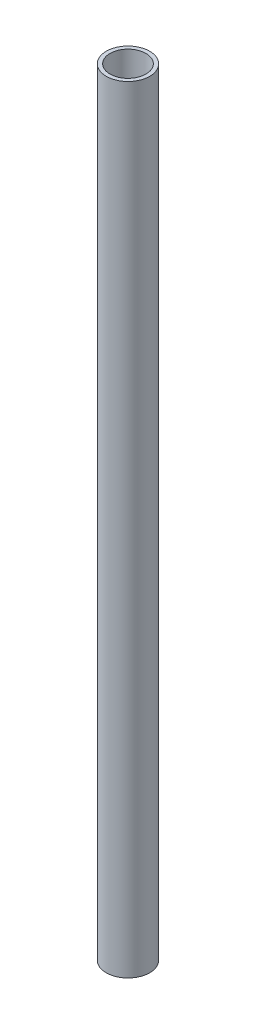
ISO-10303-21;
HEADER;
FILE_DESCRIPTION(('STEP AP214'),'2;1');
FILE_NAME('part.step','',(''),(''),'','','');
FILE_SCHEMA(('AUTOMOTIVE_DESIGN { 1 0 10303 214 1 1 1 1 }'));
ENDSEC;
DATA;
#1=APPLICATION_CONTEXT('core data for automotive mechanical design processes');
#2=APPLICATION_PROTOCOL_DEFINITION('international standard','automotive_design',2000,#1);
#3=PRODUCT_CONTEXT('',#1,'mechanical');
#4=PRODUCT('Part','Part','',(#3));
#5=PRODUCT_RELATED_PRODUCT_CATEGORY('part','',(#4));
#6=PRODUCT_DEFINITION_FORMATION('','',#4);
#7=PRODUCT_DEFINITION_CONTEXT('part definition',#1,'design');
#8=PRODUCT_DEFINITION('design','',#6,#7);
#9=PRODUCT_DEFINITION_SHAPE('','',#8);
#10=(LENGTH_UNIT() NAMED_UNIT(*) SI_UNIT(.MILLI.,.METRE.));
#11=(NAMED_UNIT(*) PLANE_ANGLE_UNIT() SI_UNIT($,.RADIAN.));
#12=(NAMED_UNIT(*) SI_UNIT($,.STERADIAN.) SOLID_ANGLE_UNIT());
#13=UNCERTAINTY_MEASURE_WITH_UNIT(LENGTH_MEASURE(1.E-05),#10,'distance_accuracy_value','');
#14=(GEOMETRIC_REPRESENTATION_CONTEXT(3) GLOBAL_UNCERTAINTY_ASSIGNED_CONTEXT((#13)) GLOBAL_UNIT_ASSIGNED_CONTEXT((#10,
#11,#12)) REPRESENTATION_CONTEXT('',''));
#15=CARTESIAN_POINT('',(0.,0.,0.));
#16=DIRECTION('',(0.,0.,1.));
#17=DIRECTION('',(1.,0.,0.));
#18=AXIS2_PLACEMENT_3D('',#15,#16,#17);
#19=CARTESIAN_POINT('',(0.,450.,0.));
#20=DIRECTION('',(0.,-1.,0.));
#21=DIRECTION('',(0.,0.,-1.));
#22=AXIS2_PLACEMENT_3D('',#19,#20,#21);
#23=CYLINDRICAL_SURFACE('',#22,12.6);
#24=CARTESIAN_POINT('',(0.,450.,0.));
#25=DIRECTION('',(0.,1.,0.));
#26=DIRECTION('',(0.,0.,1.));
#27=AXIS2_PLACEMENT_3D('',#24,#25,#26);
#28=CIRCLE('',#27,12.6);
#29=CARTESIAN_POINT('',(0.,450.,12.6));
#30=VERTEX_POINT('',#29);
#31=EDGE_CURVE('E10',#30,#30,#28,.T.);
#32=ORIENTED_EDGE('',*,*,#31,.F.);
#33=EDGE_LOOP('',(#32));
#34=FACE_BOUND('',#33,.T.);
#35=CARTESIAN_POINT('',(0.,0.,0.));
#36=DIRECTION('',(0.,1.,0.));
#37=DIRECTION('',(0.,0.,1.));
#38=AXIS2_PLACEMENT_3D('',#35,#36,#37);
#39=CIRCLE('',#38,12.6);
#40=CARTESIAN_POINT('',(0.,0.,12.6));
#41=VERTEX_POINT('',#40);
#42=EDGE_CURVE('E40',#41,#41,#39,.T.);
#43=ORIENTED_EDGE('',*,*,#42,.T.);
#44=EDGE_LOOP('',(#43));
#45=FACE_BOUND('',#44,.T.);
#46=ADVANCED_FACE('F37',(#34,#45),#23,.T.);
#47=CARTESIAN_POINT('',(0.,450.,0.));
#48=DIRECTION('',(0.,1.,0.));
#49=DIRECTION('',(0.,0.,1.));
#50=AXIS2_PLACEMENT_3D('',#47,#48,#49);
#51=PLANE('',#50);
#52=CARTESIAN_POINT('',(0.,450.,0.));
#53=DIRECTION('',(0.,1.,0.));
#54=DIRECTION('',(0.,0.,1.));
#55=AXIS2_PLACEMENT_3D('',#52,#53,#54);
#56=CIRCLE('',#55,10.4);
#57=CARTESIAN_POINT('',(0.,450.,10.4));
#58=VERTEX_POINT('',#57);
#59=EDGE_CURVE('E49',#58,#58,#56,.T.);
#60=ORIENTED_EDGE('',*,*,#59,.F.);
#61=EDGE_LOOP('',(#60));
#62=FACE_BOUND('',#61,.T.);
#63=ORIENTED_EDGE('',*,*,#31,.T.);
#64=EDGE_LOOP('',(#63));
#65=FACE_BOUND('',#64,.T.);
#66=ADVANCED_FACE('F62',(#62,#65),#51,.T.);
#67=CARTESIAN_POINT('',(0.,0.,0.));
#68=DIRECTION('',(0.,1.,0.));
#69=DIRECTION('',(0.,0.,1.));
#70=AXIS2_PLACEMENT_3D('',#67,#68,#69);
#71=PLANE('',#70);
#72=CARTESIAN_POINT('',(0.,0.,0.));
#73=DIRECTION('',(0.,1.,0.));
#74=DIRECTION('',(0.,0.,1.));
#75=AXIS2_PLACEMENT_3D('',#72,#73,#74);
#76=CIRCLE('',#75,10.4);
#77=CARTESIAN_POINT('',(0.,0.,10.4));
#78=VERTEX_POINT('',#77);
#79=EDGE_CURVE('E51',#78,#78,#76,.T.);
#80=ORIENTED_EDGE('',*,*,#79,.T.);
#81=EDGE_LOOP('',(#80));
#82=FACE_BOUND('',#81,.T.);
#83=ORIENTED_EDGE('',*,*,#42,.F.);
#84=EDGE_LOOP('',(#83));
#85=FACE_BOUND('',#84,.T.);
#86=ADVANCED_FACE('F64',(#82,#85),#71,.F.);
#87=CARTESIAN_POINT('',(0.,450.,0.));
#88=DIRECTION('',(0.,-1.,0.));
#89=DIRECTION('',(0.,0.,-1.));
#90=AXIS2_PLACEMENT_3D('',#87,#88,#89);
#91=CYLINDRICAL_SURFACE('',#90,10.4);
#92=ORIENTED_EDGE('',*,*,#59,.T.);
#93=EDGE_LOOP('',(#92));
#94=FACE_BOUND('',#93,.T.);
#95=ORIENTED_EDGE('',*,*,#79,.F.);
#96=EDGE_LOOP('',(#95));
#97=FACE_BOUND('',#96,.T.);
#98=ADVANCED_FACE('F59',(#94,#97),#91,.F.);
#99=CLOSED_SHELL('',(#46,#66,#86,#98));
#100=MANIFOLD_SOLID_BREP('B2',#99);
#101=ADVANCED_BREP_SHAPE_REPRESENTATION('',(#18,#100),#14);
#102=SHAPE_DEFINITION_REPRESENTATION(#9,#101);
ENDSEC;
END-ISO-10303-21;
